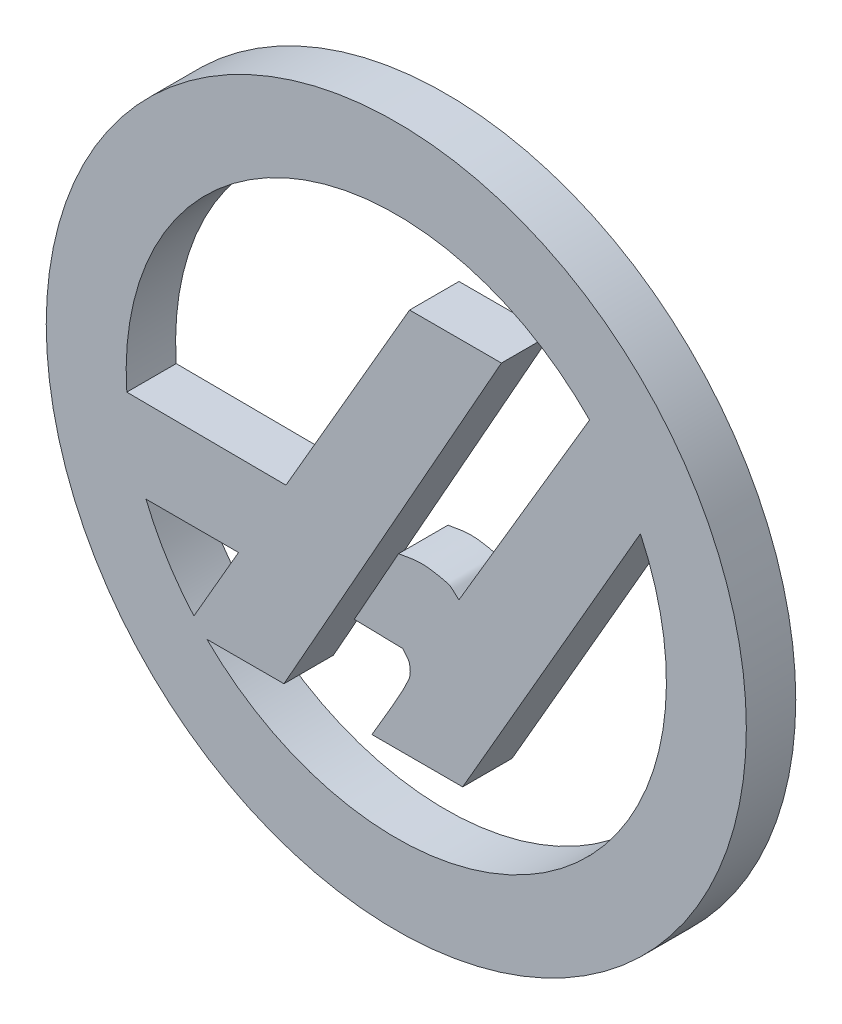
ISO-10303-21;
HEADER;
FILE_DESCRIPTION(('STEP AP214'),'2;1');
FILE_NAME('part.step','',(''),(''),'','','');
FILE_SCHEMA(('AUTOMOTIVE_DESIGN { 1 0 10303 214 1 1 1 1 }'));
ENDSEC;
DATA;
#1=APPLICATION_CONTEXT('core data for automotive mechanical design processes');
#2=APPLICATION_PROTOCOL_DEFINITION('international standard','automotive_design',2000,#1);
#3=PRODUCT_CONTEXT('',#1,'mechanical');
#4=PRODUCT('Part','Part','',(#3));
#5=PRODUCT_RELATED_PRODUCT_CATEGORY('part','',(#4));
#6=PRODUCT_DEFINITION_FORMATION('','',#4);
#7=PRODUCT_DEFINITION_CONTEXT('part definition',#1,'design');
#8=PRODUCT_DEFINITION('design','',#6,#7);
#9=PRODUCT_DEFINITION_SHAPE('','',#8);
#10=(LENGTH_UNIT() NAMED_UNIT(*) SI_UNIT(.MILLI.,.METRE.));
#11=(NAMED_UNIT(*) PLANE_ANGLE_UNIT() SI_UNIT($,.RADIAN.));
#12=(NAMED_UNIT(*) SI_UNIT($,.STERADIAN.) SOLID_ANGLE_UNIT());
#13=UNCERTAINTY_MEASURE_WITH_UNIT(LENGTH_MEASURE(1.E-05),#10,'distance_accuracy_value','');
#14=(GEOMETRIC_REPRESENTATION_CONTEXT(3) GLOBAL_UNCERTAINTY_ASSIGNED_CONTEXT((#13)) GLOBAL_UNIT_ASSIGNED_CONTEXT((#10,
#11,#12)) REPRESENTATION_CONTEXT('',''));
#15=CARTESIAN_POINT('',(0.,0.,0.));
#16=DIRECTION('',(0.,0.,1.));
#17=DIRECTION('',(1.,0.,0.));
#18=AXIS2_PLACEMENT_3D('',#15,#16,#17);
#19=CARTESIAN_POINT('',(456.634031843673,370.7972397232,50.));
#20=DIRECTION('',(0.,0.,1.));
#21=DIRECTION('',(1.,0.,0.));
#22=AXIS2_PLACEMENT_3D('',#19,#20,#21);
#23=PLANE('',#22);
#24=CARTESIAN_POINT('',(456.634031843673,370.7972397232,50.));
#25=DIRECTION('',(0.,0.,1.));
#26=DIRECTION('',(1.,0.,0.));
#27=AXIS2_PLACEMENT_3D('',#24,#25,#26);
#28=CIRCLE('',#27,354.154198637516);
#29=CARTESIAN_POINT('',(810.78823048119,370.7972397232,50.));
#30=VERTEX_POINT('',#29);
#31=EDGE_CURVE('E11',#30,#30,#28,.T.);
#32=ORIENTED_EDGE('',*,*,#31,.T.);
#33=EDGE_LOOP('',(#32));
#34=FACE_BOUND('',#33,.T.);
#35=DIRECTION('',(0.999980711178834,-0.00621106031788096,0.));
#36=VECTOR('',#35,1.);
#37=CARTESIAN_POINT('',(344.999999995328,351.000000011869,50.));
#38=LINE('',#37,#36);
#39=CARTESIAN_POINT('',(183.999999995328,352.000000011869,50.));
#40=VERTEX_POINT('',#39);
#41=CARTESIAN_POINT('',(344.999999995328,351.000000011869,50.));
#42=VERTEX_POINT('',#41);
#43=EDGE_CURVE('E185',#40,#42,#38,.T.);
#44=ORIENTED_EDGE('',*,*,#43,.F.);
#45=CARTESIAN_POINT('',(456.634031843673,370.7972397232,50.));
#46=DIRECTION('',(0.,0.,1.));
#47=DIRECTION('',(1.,0.,0.));
#48=AXIS2_PLACEMENT_3D('',#45,#46,#47);
#49=CIRCLE('',#48,273.281268188381);
#50=CARTESIAN_POINT('',(652.184505988232,561.696856287739,50.));
#51=VERTEX_POINT('',#50);
#52=EDGE_CURVE('E183',#51,#40,#49,.T.);
#53=ORIENTED_EDGE('',*,*,#52,.F.);
#54=DIRECTION('',(0.508729312126642,0.860926528214315,0.));
#55=VECTOR('',#54,1.);
#56=CARTESIAN_POINT('',(652.184505988232,561.696856287739,50.));
#57=LINE('',#56,#55);
#58=CARTESIAN_POINT('',(520.000000000014,337.999999999987,50.));
#59=VERTEX_POINT('',#58);
#60=EDGE_CURVE('E297',#59,#51,#57,.T.);
#61=ORIENTED_EDGE('',*,*,#60,.F.);
#62=CARTESIAN_POINT('',(459.000000000014,347.999999999985,50.));
#63=CARTESIAN_POINT('',(477.851743634498,351.141957272399,50.));
#64=CARTESIAN_POINT('',(483.294181496903,353.05040453136,50.));
#65=CARTESIAN_POINT('',(508.000000000014,346.999999999986,50.));
#66=CARTESIAN_POINT('',(512.856486558174,345.81065635309,50.));
#67=CARTESIAN_POINT('',(516.000000000014,340.999999999987,50.));
#68=CARTESIAN_POINT('',(520.000000000014,337.999999999987,50.));
#69=B_SPLINE_CURVE_WITH_KNOTS('',3,(#62,#63,#64,#65,#66,#67,#68),.UNSPECIFIED.,.F.,.F.,(4,3,4),
(0.,1.,2.),.UNSPECIFIED.);
#70=CARTESIAN_POINT('',(459.000000000014,347.999999999985,50.));
#71=VERTEX_POINT('',#70);
#72=EDGE_CURVE('E291',#71,#59,#69,.T.);
#73=ORIENTED_EDGE('',*,*,#72,.F.);
#74=DIRECTION('',(0.488992524128992,0.872287975009376,0.));
#75=VECTOR('',#74,1.);
#76=CARTESIAN_POINT('',(459.000000000014,347.999999999985,50.));
#77=LINE('',#76,#75);
#78=CARTESIAN_POINT('',(414.153111070255,268.000000000617,50.));
#79=VERTEX_POINT('',#78);
#80=EDGE_CURVE('E298',#79,#71,#77,.T.);
#81=ORIENTED_EDGE('',*,*,#80,.F.);
#82=DIRECTION('',(-0.999790511734195,0.020467844201998,0.));
#83=VECTOR('',#82,1.);
#84=CARTESIAN_POINT('',(414.153111070255,268.000000000617,50.));
#85=LINE('',#84,#83);
#86=CARTESIAN_POINT('',(463.000000000014,266.999999999985,50.));
#87=VERTEX_POINT('',#86);
#88=EDGE_CURVE('E207',#87,#79,#85,.T.);
#89=ORIENTED_EDGE('',*,*,#88,.F.);
#90=CARTESIAN_POINT('',(432.000000000013,175.999999999985,50.));
#91=CARTESIAN_POINT('',(444.333333333347,197.999999999985,50.));
#92=CARTESIAN_POINT('',(458.288028235039,219.166586500959,50.));
#93=CARTESIAN_POINT('',(469.000000000014,241.999999999985,50.));
#94=CARTESIAN_POINT('',(471.128314938588,246.536671316419,50.));
#95=CARTESIAN_POINT('',(471.169454920433,252.127271164905,50.));
#96=CARTESIAN_POINT('',(470.000000000014,256.999999999985,50.));
#97=CARTESIAN_POINT('',(469.050440025481,260.956499893871,50.));
#98=CARTESIAN_POINT('',(465.333333333347,263.666666666652,50.));
#99=CARTESIAN_POINT('',(463.000000000014,266.999999999985,50.));
#100=B_SPLINE_CURVE_WITH_KNOTS('',3,(#90,#91,#92,#93,#94,#95,#96,#97,#98,#99),.UNSPECIFIED.,.F.,
.F.,(4,3,3,4),(0.,1.,2.,3.),.UNSPECIFIED.);
#101=CARTESIAN_POINT('',(432.000000000013,175.999999999985,50.));
#102=VERTEX_POINT('',#101);
#103=EDGE_CURVE('E202',#102,#87,#100,.T.);
#104=ORIENTED_EDGE('',*,*,#103,.F.);
#105=DIRECTION('',(-1.,0.,0.));
#106=VECTOR('',#105,1.);
#107=CARTESIAN_POINT('',(432.000000000013,175.999999999985,50.));
#108=LINE('',#107,#106);
#109=CARTESIAN_POINT('',(523.78372406925,175.999999999985,50.));
#110=VERTEX_POINT('',#109);
#111=EDGE_CURVE('E200',#110,#102,#108,.T.);
#112=ORIENTED_EDGE('',*,*,#111,.F.);
#113=DIRECTION('',(-0.499610631852908,-0.866250088911705,0.));
#114=VECTOR('',#113,1.);
#115=CARTESIAN_POINT('',(523.78372406925,175.999999999985,50.));
#116=LINE('',#115,#114);
#117=CARTESIAN_POINT('',(703.607534397801,487.78758367857,50.));
#118=VERTEX_POINT('',#117);
#119=EDGE_CURVE('E198',#118,#110,#116,.T.);
#120=ORIENTED_EDGE('',*,*,#119,.F.);
#121=CARTESIAN_POINT('',(456.634031843673,370.7972397232,50.));
#122=DIRECTION('',(0.,0.,1.));
#123=DIRECTION('',(1.,0.,0.));
#124=AXIS2_PLACEMENT_3D('',#121,#122,#123);
#125=CIRCLE('',#124,273.281268188381);
#126=CARTESIAN_POINT('',(264.996930573145,175.969436370395,50.));
#127=VERTEX_POINT('',#126);
#128=EDGE_CURVE('E196',#127,#118,#125,.T.);
#129=ORIENTED_EDGE('',*,*,#128,.F.);
#130=DIRECTION('',(-0.999999923235036,-0.000391828944071524,0.));
#131=VECTOR('',#130,1.);
#132=CARTESIAN_POINT('',(264.996930573145,175.969436370395,50.));
#133=LINE('',#132,#131);
#134=CARTESIAN_POINT('',(342.999405137408,175.999999999985,50.));
#135=VERTEX_POINT('',#134);
#136=EDGE_CURVE('E194',#135,#127,#133,.T.);
#137=ORIENTED_EDGE('',*,*,#136,.F.);
#138=DIRECTION('',(-0.490368068183299,-0.871515437445706,0.));
#139=VECTOR('',#138,1.);
#140=CARTESIAN_POINT('',(342.999405137408,175.999999999985,50.));
#141=LINE('',#140,#139);
#142=CARTESIAN_POINT('',(562.999999995105,567.000000012326,50.));
#143=VERTEX_POINT('',#142);
#144=EDGE_CURVE('E192',#143,#135,#141,.T.);
#145=ORIENTED_EDGE('',*,*,#144,.F.);
#146=DIRECTION('',(1.,0.,0.));
#147=VECTOR('',#146,1.);
#148=CARTESIAN_POINT('',(562.999999995105,567.000000012326,50.));
#149=LINE('',#148,#147);
#150=CARTESIAN_POINT('',(470.080751257169,567.000000012326,50.));
#151=VERTEX_POINT('',#150);
#152=EDGE_CURVE('E190',#151,#143,#149,.T.);
#153=ORIENTED_EDGE('',*,*,#152,.F.);
#154=DIRECTION('',(0.501120644832425,0.865377431715627,0.));
#155=VECTOR('',#154,1.);
#156=CARTESIAN_POINT('',(470.080751257169,567.000000012326,50.));
#157=LINE('',#156,#155);
#158=EDGE_CURVE('E188',#42,#151,#157,.T.);
#159=ORIENTED_EDGE('',*,*,#158,.F.);
#160=EDGE_LOOP('',(#44,#53,#61,#73,#81,#89,#104,#112,#120,#129,#137,#145,#153,#159));
#161=FACE_BOUND('',#160,.T.);
#162=DIRECTION('',(0.499722453489577,0.866185586048601,0.));
#163=VECTOR('',#162,1.);
#164=CARTESIAN_POINT('',(297.000000000021,268.000000000617,50.));
#165=LINE('',#164,#163);
#166=CARTESIAN_POINT('',(251.884299831457,189.799453041773,50.));
#167=VERTEX_POINT('',#166);
#168=CARTESIAN_POINT('',(297.000000000021,268.000000000617,50.));
#169=VERTEX_POINT('',#168);
#170=EDGE_CURVE('E164',#167,#169,#165,.T.);
#171=ORIENTED_EDGE('',*,*,#170,.F.);
#172=CARTESIAN_POINT('',(456.634031843673,370.7972397232,50.));
#173=DIRECTION('',(0.,0.,1.));
#174=DIRECTION('',(1.,0.,0.));
#175=AXIS2_PLACEMENT_3D('',#172,#173,#174);
#176=CIRCLE('',#175,273.281268188381);
#177=CARTESIAN_POINT('',(203.423883847848,268.000000000617,50.));
#178=VERTEX_POINT('',#177);
#179=EDGE_CURVE('E156',#178,#167,#176,.T.);
#180=ORIENTED_EDGE('',*,*,#179,.F.);
#181=DIRECTION('',(-1.,0.,0.));
#182=VECTOR('',#181,1.);
#183=CARTESIAN_POINT('',(203.423883847848,268.000000000617,50.));
#184=LINE('',#183,#182);
#185=EDGE_CURVE('E173',#169,#178,#184,.T.);
#186=ORIENTED_EDGE('',*,*,#185,.F.);
#187=EDGE_LOOP('',(#171,#180,#186));
#188=FACE_BOUND('',#187,.T.);
#189=ADVANCED_FACE('F37',(#34,#161,#188),#23,.T.);
#190=CARTESIAN_POINT('',(456.634031843673,370.7972397232,0.));
#191=DIRECTION('',(0.,0.,1.));
#192=DIRECTION('',(1.,0.,0.));
#193=AXIS2_PLACEMENT_3D('',#190,#191,#192);
#194=PLANE('',#193);
#195=CARTESIAN_POINT('',(456.634031843673,370.7972397232,0.));
#196=DIRECTION('',(0.,0.,1.));
#197=DIRECTION('',(1.,0.,0.));
#198=AXIS2_PLACEMENT_3D('',#195,#196,#197);
#199=CIRCLE('',#198,273.281268188381);
#200=CARTESIAN_POINT('',(652.184505988232,561.696856287739,0.));
#201=VERTEX_POINT('',#200);
#202=CARTESIAN_POINT('',(183.999999995328,352.000000011869,0.));
#203=VERTEX_POINT('',#202);
#204=EDGE_CURVE('E171',#201,#203,#199,.T.);
#205=ORIENTED_EDGE('',*,*,#204,.T.);
#206=DIRECTION('',(0.999980711178834,-0.00621106031788096,0.));
#207=VECTOR('',#206,1.);
#208=CARTESIAN_POINT('',(344.999999995328,351.000000011869,0.));
#209=LINE('',#208,#207);
#210=CARTESIAN_POINT('',(344.999999995328,351.000000011869,0.));
#211=VERTEX_POINT('',#210);
#212=EDGE_CURVE('E305',#203,#211,#209,.T.);
#213=ORIENTED_EDGE('',*,*,#212,.T.);
#214=DIRECTION('',(0.501120644832425,0.865377431715627,0.));
#215=VECTOR('',#214,1.);
#216=CARTESIAN_POINT('',(470.080751257169,567.000000012326,0.));
#217=LINE('',#216,#215);
#218=CARTESIAN_POINT('',(470.080751257169,567.000000012326,0.));
#219=VERTEX_POINT('',#218);
#220=EDGE_CURVE('E307',#211,#219,#217,.T.);
#221=ORIENTED_EDGE('',*,*,#220,.T.);
#222=DIRECTION('',(1.,0.,0.));
#223=VECTOR('',#222,1.);
#224=CARTESIAN_POINT('',(562.999999995105,567.000000012326,0.));
#225=LINE('',#224,#223);
#226=CARTESIAN_POINT('',(562.999999995105,567.000000012326,0.));
#227=VERTEX_POINT('',#226);
#228=EDGE_CURVE('E310',#219,#227,#225,.T.);
#229=ORIENTED_EDGE('',*,*,#228,.T.);
#230=DIRECTION('',(-0.490368068183299,-0.871515437445706,0.));
#231=VECTOR('',#230,1.);
#232=CARTESIAN_POINT('',(342.999405137408,175.999999999985,0.));
#233=LINE('',#232,#231);
#234=CARTESIAN_POINT('',(342.999405137408,175.999999999985,0.));
#235=VERTEX_POINT('',#234);
#236=EDGE_CURVE('E313',#227,#235,#233,.T.);
#237=ORIENTED_EDGE('',*,*,#236,.T.);
#238=DIRECTION('',(-0.999999923235036,-0.000391828944071524,0.));
#239=VECTOR('',#238,1.);
#240=CARTESIAN_POINT('',(264.996930573145,175.969436370395,0.));
#241=LINE('',#240,#239);
#242=CARTESIAN_POINT('',(264.996930573145,175.969436370395,0.));
#243=VERTEX_POINT('',#242);
#244=EDGE_CURVE('E316',#235,#243,#241,.T.);
#245=ORIENTED_EDGE('',*,*,#244,.T.);
#246=CARTESIAN_POINT('',(456.634031843673,370.7972397232,0.));
#247=DIRECTION('',(0.,0.,1.));
#248=DIRECTION('',(1.,0.,0.));
#249=AXIS2_PLACEMENT_3D('',#246,#247,#248);
#250=CIRCLE('',#249,273.281268188381);
#251=CARTESIAN_POINT('',(703.607534397801,487.78758367857,0.));
#252=VERTEX_POINT('',#251);
#253=EDGE_CURVE('E319',#243,#252,#250,.T.);
#254=ORIENTED_EDGE('',*,*,#253,.T.);
#255=DIRECTION('',(-0.499610631852908,-0.866250088911705,0.));
#256=VECTOR('',#255,1.);
#257=CARTESIAN_POINT('',(523.78372406925,175.999999999985,0.));
#258=LINE('',#257,#256);
#259=CARTESIAN_POINT('',(523.78372406925,175.999999999985,0.));
#260=VERTEX_POINT('',#259);
#261=EDGE_CURVE('E322',#252,#260,#258,.T.);
#262=ORIENTED_EDGE('',*,*,#261,.T.);
#263=DIRECTION('',(-1.,0.,0.));
#264=VECTOR('',#263,1.);
#265=CARTESIAN_POINT('',(432.000000000013,175.999999999985,0.));
#266=LINE('',#265,#264);
#267=CARTESIAN_POINT('',(432.000000000013,175.999999999985,0.));
#268=VERTEX_POINT('',#267);
#269=EDGE_CURVE('E325',#260,#268,#266,.T.);
#270=ORIENTED_EDGE('',*,*,#269,.T.);
#271=CARTESIAN_POINT('',(432.000000000013,175.999999999985,0.));
#272=CARTESIAN_POINT('',(444.333333333347,197.999999999985,0.));
#273=CARTESIAN_POINT('',(458.288028235039,219.166586500959,0.));
#274=CARTESIAN_POINT('',(469.000000000014,241.999999999985,0.));
#275=CARTESIAN_POINT('',(471.128314938588,246.536671316419,0.));
#276=CARTESIAN_POINT('',(471.169454920433,252.127271164905,0.));
#277=CARTESIAN_POINT('',(470.000000000014,256.999999999985,0.));
#278=CARTESIAN_POINT('',(469.050440025481,260.956499893871,0.));
#279=CARTESIAN_POINT('',(465.333333333347,263.666666666652,0.));
#280=CARTESIAN_POINT('',(463.000000000014,266.999999999985,0.));
#281=B_SPLINE_CURVE_WITH_KNOTS('',3,(#271,#272,#273,#274,#275,#276,#277,#278,#279,#280),
.UNSPECIFIED.,.F.,.F.,(4,3,3,4),(0.,1.,2.,3.),.UNSPECIFIED.);
#282=CARTESIAN_POINT('',(463.000000000014,266.999999999985,0.));
#283=VERTEX_POINT('',#282);
#284=EDGE_CURVE('E328',#268,#283,#281,.T.);
#285=ORIENTED_EDGE('',*,*,#284,.T.);
#286=DIRECTION('',(-0.999790511734195,0.020467844201998,0.));
#287=VECTOR('',#286,1.);
#288=CARTESIAN_POINT('',(414.153111070255,268.000000000617,0.));
#289=LINE('',#288,#287);
#290=CARTESIAN_POINT('',(414.153111070255,268.000000000617,0.));
#291=VERTEX_POINT('',#290);
#292=EDGE_CURVE('E333',#283,#291,#289,.T.);
#293=ORIENTED_EDGE('',*,*,#292,.T.);
#294=DIRECTION('',(0.488992524128992,0.872287975009376,0.));
#295=VECTOR('',#294,1.);
#296=CARTESIAN_POINT('',(459.000000000014,347.999999999985,0.));
#297=LINE('',#296,#295);
#298=CARTESIAN_POINT('',(459.000000000014,347.999999999985,0.));
#299=VERTEX_POINT('',#298);
#300=EDGE_CURVE('E339',#291,#299,#297,.T.);
#301=ORIENTED_EDGE('',*,*,#300,.T.);
#302=CARTESIAN_POINT('',(459.000000000014,347.999999999985,0.));
#303=CARTESIAN_POINT('',(477.851743634498,351.141957272399,0.));
#304=CARTESIAN_POINT('',(483.294181496903,353.05040453136,0.));
#305=CARTESIAN_POINT('',(508.000000000014,346.999999999986,0.));
#306=CARTESIAN_POINT('',(512.856486558174,345.81065635309,0.));
#307=CARTESIAN_POINT('',(516.000000000014,340.999999999987,0.));
#308=CARTESIAN_POINT('',(520.000000000014,337.999999999987,0.));
#309=B_SPLINE_CURVE_WITH_KNOTS('',3,(#302,#303,#304,#305,#306,#307,#308),.UNSPECIFIED.,.F.,.F.,
(4,3,4),(0.,1.,2.),.UNSPECIFIED.);
#310=CARTESIAN_POINT('',(520.000000000014,337.999999999987,0.));
#311=VERTEX_POINT('',#310);
#312=EDGE_CURVE('E342',#299,#311,#309,.T.);
#313=ORIENTED_EDGE('',*,*,#312,.T.);
#314=DIRECTION('',(0.508729312126642,0.860926528214315,0.));
#315=VECTOR('',#314,1.);
#316=CARTESIAN_POINT('',(652.184505988232,561.696856287739,0.));
#317=LINE('',#316,#315);
#318=EDGE_CURVE('E186',#311,#201,#317,.T.);
#319=ORIENTED_EDGE('',*,*,#318,.T.);
#320=EDGE_LOOP('',(#205,#213,#221,#229,#237,#245,#254,#262,#270,#285,#293,#301,#313,#319));
#321=FACE_BOUND('',#320,.T.);
#322=CARTESIAN_POINT('',(456.634031843673,370.7972397232,0.));
#323=DIRECTION('',(0.,0.,1.));
#324=DIRECTION('',(1.,0.,0.));
#325=AXIS2_PLACEMENT_3D('',#322,#323,#324);
#326=CIRCLE('',#325,354.154198637516);
#327=CARTESIAN_POINT('',(810.78823048119,370.7972397232,0.));
#328=VERTEX_POINT('',#327);
#329=EDGE_CURVE('E41',#328,#328,#326,.T.);
#330=ORIENTED_EDGE('',*,*,#329,.F.);
#331=EDGE_LOOP('',(#330));
#332=FACE_BOUND('',#331,.T.);
#333=CARTESIAN_POINT('',(456.634031843673,370.7972397232,0.));
#334=DIRECTION('',(0.,0.,1.));
#335=DIRECTION('',(1.,0.,0.));
#336=AXIS2_PLACEMENT_3D('',#333,#334,#335);
#337=CIRCLE('',#336,273.281268188381);
#338=CARTESIAN_POINT('',(203.423883847848,268.000000000617,0.));
#339=VERTEX_POINT('',#338);
#340=CARTESIAN_POINT('',(251.884299831457,189.799453041773,0.));
#341=VERTEX_POINT('',#340);
#342=EDGE_CURVE('E60',#339,#341,#337,.T.);
#343=ORIENTED_EDGE('',*,*,#342,.T.);
#344=DIRECTION('',(0.499722453489577,0.866185586048601,0.));
#345=VECTOR('',#344,1.);
#346=CARTESIAN_POINT('',(297.000000000021,268.000000000617,0.));
#347=LINE('',#346,#345);
#348=CARTESIAN_POINT('',(297.000000000021,268.000000000617,0.));
#349=VERTEX_POINT('',#348);
#350=EDGE_CURVE('E170',#341,#349,#347,.T.);
#351=ORIENTED_EDGE('',*,*,#350,.T.);
#352=DIRECTION('',(-1.,0.,0.));
#353=VECTOR('',#352,1.);
#354=CARTESIAN_POINT('',(203.423883847848,268.000000000617,0.));
#355=LINE('',#354,#353);
#356=EDGE_CURVE('E165',#349,#339,#355,.T.);
#357=ORIENTED_EDGE('',*,*,#356,.T.);
#358=EDGE_LOOP('',(#343,#351,#357));
#359=FACE_BOUND('',#358,.T.);
#360=ADVANCED_FACE('F257',(#321,#332,#359),#194,.F.);
#361=CARTESIAN_POINT('',(456.634031843673,370.7972397232,50.));
#362=DIRECTION('',(0.,0.,-1.));
#363=DIRECTION('',(-1.,0.,0.));
#364=AXIS2_PLACEMENT_3D('',#361,#362,#363);
#365=CYLINDRICAL_SURFACE('',#364,354.154198637516);
#366=ORIENTED_EDGE('',*,*,#31,.F.);
#367=EDGE_LOOP('',(#366));
#368=FACE_BOUND('',#367,.T.);
#369=ORIENTED_EDGE('',*,*,#329,.T.);
#370=EDGE_LOOP('',(#369));
#371=FACE_BOUND('',#370,.T.);
#372=ADVANCED_FACE('F39',(#368,#371),#365,.T.);
#373=CARTESIAN_POINT('',(456.634031843673,370.7972397232,50.));
#374=DIRECTION('',(0.,0.,-1.));
#375=DIRECTION('',(-1.,0.,0.));
#376=AXIS2_PLACEMENT_3D('',#373,#374,#375);
#377=CYLINDRICAL_SURFACE('',#376,273.281268188381);
#378=ORIENTED_EDGE('',*,*,#204,.F.);
#379=DIRECTION('',(0.,0.,-1.));
#380=VECTOR('',#379,1.);
#381=CARTESIAN_POINT('',(652.184505988232,561.696856287739,50.));
#382=LINE('',#381,#380);
#383=EDGE_CURVE('E303',#51,#201,#382,.T.);
#384=ORIENTED_EDGE('',*,*,#383,.F.);
#385=ORIENTED_EDGE('',*,*,#52,.T.);
#386=DIRECTION('',(0.,0.,-1.));
#387=VECTOR('',#386,1.);
#388=CARTESIAN_POINT('',(183.999999995328,352.000000011869,50.));
#389=LINE('',#388,#387);
#390=EDGE_CURVE('E377',#40,#203,#389,.T.);
#391=ORIENTED_EDGE('',*,*,#390,.T.);
#392=EDGE_LOOP('',(#378,#384,#385,#391));
#393=FACE_BOUND('',#392,.T.);
#394=ADVANCED_FACE('F251',(#393),#377,.F.);
#395=CARTESIAN_POINT('',(344.999999995328,351.000000011869,50.));
#396=DIRECTION('',(0.00621106031788096,0.999980711178834,0.));
#397=DIRECTION('',(-0.999980711178835,0.00621106031788096,0.));
#398=AXIS2_PLACEMENT_3D('',#395,#396,#397);
#399=PLANE('',#398);
#400=ORIENTED_EDGE('',*,*,#212,.F.);
#401=ORIENTED_EDGE('',*,*,#390,.F.);
#402=ORIENTED_EDGE('',*,*,#43,.T.);
#403=DIRECTION('',(0.,0.,-1.));
#404=VECTOR('',#403,1.);
#405=CARTESIAN_POINT('',(344.999999995328,351.000000011869,50.));
#406=LINE('',#405,#404);
#407=EDGE_CURVE('E375',#42,#211,#406,.T.);
#408=ORIENTED_EDGE('',*,*,#407,.T.);
#409=EDGE_LOOP('',(#400,#401,#402,#408));
#410=FACE_BOUND('',#409,.T.);
#411=ADVANCED_FACE('F247',(#410),#399,.T.);
#412=CARTESIAN_POINT('',(470.080751257169,567.000000012326,50.));
#413=DIRECTION('',(-0.865377431715627,0.501120644832425,0.));
#414=DIRECTION('',(-0.501120644832425,-0.865377431715627,0.));
#415=AXIS2_PLACEMENT_3D('',#412,#413,#414);
#416=PLANE('',#415);
#417=ORIENTED_EDGE('',*,*,#220,.F.);
#418=ORIENTED_EDGE('',*,*,#407,.F.);
#419=ORIENTED_EDGE('',*,*,#158,.T.);
#420=DIRECTION('',(0.,0.,-1.));
#421=VECTOR('',#420,1.);
#422=CARTESIAN_POINT('',(470.080751257169,567.000000012326,50.));
#423=LINE('',#422,#421);
#424=EDGE_CURVE('E373',#151,#219,#423,.T.);
#425=ORIENTED_EDGE('',*,*,#424,.T.);
#426=EDGE_LOOP('',(#417,#418,#419,#425));
#427=FACE_BOUND('',#426,.T.);
#428=ADVANCED_FACE('F243',(#427),#416,.T.);
#429=CARTESIAN_POINT('',(562.999999995105,567.000000012326,50.));
#430=DIRECTION('',(0.,1.,0.));
#431=DIRECTION('',(-1.,0.,0.));
#432=AXIS2_PLACEMENT_3D('',#429,#430,#431);
#433=PLANE('',#432);
#434=ORIENTED_EDGE('',*,*,#228,.F.);
#435=ORIENTED_EDGE('',*,*,#424,.F.);
#436=ORIENTED_EDGE('',*,*,#152,.T.);
#437=DIRECTION('',(0.,0.,-1.));
#438=VECTOR('',#437,1.);
#439=CARTESIAN_POINT('',(562.999999995105,567.000000012326,50.));
#440=LINE('',#439,#438);
#441=EDGE_CURVE('E371',#143,#227,#440,.T.);
#442=ORIENTED_EDGE('',*,*,#441,.T.);
#443=EDGE_LOOP('',(#434,#435,#436,#442));
#444=FACE_BOUND('',#443,.T.);
#445=ADVANCED_FACE('F239',(#444),#433,.T.);
#446=CARTESIAN_POINT('',(342.999405137408,175.999999999985,50.));
#447=DIRECTION('',(0.871515437445706,-0.490368068183298,0.));
#448=DIRECTION('',(0.490368068183299,0.871515437445706,0.));
#449=AXIS2_PLACEMENT_3D('',#446,#447,#448);
#450=PLANE('',#449);
#451=ORIENTED_EDGE('',*,*,#236,.F.);
#452=ORIENTED_EDGE('',*,*,#441,.F.);
#453=ORIENTED_EDGE('',*,*,#144,.T.);
#454=DIRECTION('',(0.,0.,-1.));
#455=VECTOR('',#454,1.);
#456=CARTESIAN_POINT('',(342.999405137408,175.999999999985,50.));
#457=LINE('',#456,#455);
#458=EDGE_CURVE('E369',#135,#235,#457,.T.);
#459=ORIENTED_EDGE('',*,*,#458,.T.);
#460=EDGE_LOOP('',(#451,#452,#453,#459));
#461=FACE_BOUND('',#460,.T.);
#462=ADVANCED_FACE('F235',(#461),#450,.T.);
#463=CARTESIAN_POINT('',(264.996930573145,175.969436370395,50.));
#464=DIRECTION('',(0.000391828944071524,-0.999999923235036,0.));
#465=DIRECTION('',(0.999999923235037,0.000391828944071524,0.));
#466=AXIS2_PLACEMENT_3D('',#463,#464,#465);
#467=PLANE('',#466);
#468=ORIENTED_EDGE('',*,*,#244,.F.);
#469=ORIENTED_EDGE('',*,*,#458,.F.);
#470=ORIENTED_EDGE('',*,*,#136,.T.);
#471=DIRECTION('',(0.,0.,-1.));
#472=VECTOR('',#471,1.);
#473=CARTESIAN_POINT('',(264.996930573145,175.969436370395,50.));
#474=LINE('',#473,#472);
#475=EDGE_CURVE('E367',#127,#243,#474,.T.);
#476=ORIENTED_EDGE('',*,*,#475,.T.);
#477=EDGE_LOOP('',(#468,#469,#470,#476));
#478=FACE_BOUND('',#477,.T.);
#479=ADVANCED_FACE('F231',(#478),#467,.T.);
#480=CARTESIAN_POINT('',(456.634031843673,370.7972397232,50.));
#481=DIRECTION('',(0.,0.,-1.));
#482=DIRECTION('',(-1.,0.,0.));
#483=AXIS2_PLACEMENT_3D('',#480,#481,#482);
#484=CYLINDRICAL_SURFACE('',#483,273.281268188381);
#485=ORIENTED_EDGE('',*,*,#253,.F.);
#486=ORIENTED_EDGE('',*,*,#475,.F.);
#487=ORIENTED_EDGE('',*,*,#128,.T.);
#488=DIRECTION('',(0.,0.,-1.));
#489=VECTOR('',#488,1.);
#490=CARTESIAN_POINT('',(703.607534397801,487.78758367857,50.));
#491=LINE('',#490,#489);
#492=EDGE_CURVE('E365',#118,#252,#491,.T.);
#493=ORIENTED_EDGE('',*,*,#492,.T.);
#494=EDGE_LOOP('',(#485,#486,#487,#493));
#495=FACE_BOUND('',#494,.T.);
#496=ADVANCED_FACE('F227',(#495),#484,.F.);
#497=CARTESIAN_POINT('',(523.78372406925,175.999999999985,50.));
#498=DIRECTION('',(0.866250088911705,-0.499610631852908,0.));
#499=DIRECTION('',(0.499610631852909,0.866250088911706,0.));
#500=AXIS2_PLACEMENT_3D('',#497,#498,#499);
#501=PLANE('',#500);
#502=ORIENTED_EDGE('',*,*,#261,.F.);
#503=ORIENTED_EDGE('',*,*,#492,.F.);
#504=ORIENTED_EDGE('',*,*,#119,.T.);
#505=DIRECTION('',(0.,0.,-1.));
#506=VECTOR('',#505,1.);
#507=CARTESIAN_POINT('',(523.78372406925,175.999999999985,50.));
#508=LINE('',#507,#506);
#509=EDGE_CURVE('E363',#110,#260,#508,.T.);
#510=ORIENTED_EDGE('',*,*,#509,.T.);
#511=EDGE_LOOP('',(#502,#503,#504,#510));
#512=FACE_BOUND('',#511,.T.);
#513=ADVANCED_FACE('F223',(#512),#501,.T.);
#514=CARTESIAN_POINT('',(432.000000000013,175.999999999985,50.));
#515=DIRECTION('',(0.,-1.,0.));
#516=DIRECTION('',(0.,0.,-1.));
#517=AXIS2_PLACEMENT_3D('',#514,#515,#516);
#518=PLANE('',#517);
#519=ORIENTED_EDGE('',*,*,#269,.F.);
#520=ORIENTED_EDGE('',*,*,#509,.F.);
#521=ORIENTED_EDGE('',*,*,#111,.T.);
#522=DIRECTION('',(0.,0.,-1.));
#523=VECTOR('',#522,1.);
#524=CARTESIAN_POINT('',(432.000000000013,175.999999999985,50.));
#525=LINE('',#524,#523);
#526=EDGE_CURVE('E361',#102,#268,#525,.T.);
#527=ORIENTED_EDGE('',*,*,#526,.T.);
#528=EDGE_LOOP('',(#519,#520,#521,#527));
#529=FACE_BOUND('',#528,.T.);
#530=ADVANCED_FACE('F218',(#529),#518,.T.);
#531=DIRECTION('',(0.,0.,-1.));
#532=VECTOR('',#531,1.);
#533=SURFACE_OF_LINEAR_EXTRUSION('',#100,#532);
#534=ORIENTED_EDGE('',*,*,#284,.F.);
#535=ORIENTED_EDGE('',*,*,#526,.F.);
#536=ORIENTED_EDGE('',*,*,#103,.T.);
#537=DIRECTION('',(0.,0.,-1.));
#538=VECTOR('',#537,1.);
#539=CARTESIAN_POINT('',(463.000000000014,266.999999999985,50.));
#540=LINE('',#539,#538);
#541=EDGE_CURVE('E359',#87,#283,#540,.T.);
#542=ORIENTED_EDGE('',*,*,#541,.T.);
#543=EDGE_LOOP('',(#534,#535,#536,#542));
#544=FACE_BOUND('',#543,.T.);
#545=ADVANCED_FACE('F213',(#544),#533,.T.);
#546=CARTESIAN_POINT('',(414.153111070255,268.000000000617,50.));
#547=DIRECTION('',(-0.020467844201998,-0.999790511734195,0.));
#548=DIRECTION('',(0.999790511734195,-0.020467844201998,0.));
#549=AXIS2_PLACEMENT_3D('',#546,#547,#548);
#550=PLANE('',#549);
#551=ORIENTED_EDGE('',*,*,#292,.F.);
#552=ORIENTED_EDGE('',*,*,#541,.F.);
#553=ORIENTED_EDGE('',*,*,#88,.T.);
#554=DIRECTION('',(0.,0.,-1.));
#555=VECTOR('',#554,1.);
#556=CARTESIAN_POINT('',(414.153111070255,268.000000000617,50.));
#557=LINE('',#556,#555);
#558=EDGE_CURVE('E357',#79,#291,#557,.T.);
#559=ORIENTED_EDGE('',*,*,#558,.T.);
#560=EDGE_LOOP('',(#551,#552,#553,#559));
#561=FACE_BOUND('',#560,.T.);
#562=ADVANCED_FACE('F217',(#561),#550,.T.);
#563=CARTESIAN_POINT('',(459.000000000014,347.999999999985,50.));
#564=DIRECTION('',(-0.872287975009376,0.488992524128992,0.));
#565=DIRECTION('',(-0.488992524128992,-0.872287975009376,0.));
#566=AXIS2_PLACEMENT_3D('',#563,#564,#565);
#567=PLANE('',#566);
#568=ORIENTED_EDGE('',*,*,#300,.F.);
#569=ORIENTED_EDGE('',*,*,#558,.F.);
#570=ORIENTED_EDGE('',*,*,#80,.T.);
#571=DIRECTION('',(0.,0.,-1.));
#572=VECTOR('',#571,1.);
#573=CARTESIAN_POINT('',(459.000000000014,347.999999999985,50.));
#574=LINE('',#573,#572);
#575=EDGE_CURVE('E355',#71,#299,#574,.T.);
#576=ORIENTED_EDGE('',*,*,#575,.T.);
#577=EDGE_LOOP('',(#568,#569,#570,#576));
#578=FACE_BOUND('',#577,.T.);
#579=ADVANCED_FACE('F289',(#578),#567,.T.);
#580=DIRECTION('',(0.,0.,-1.));
#581=VECTOR('',#580,1.);
#582=SURFACE_OF_LINEAR_EXTRUSION('',#69,#581);
#583=ORIENTED_EDGE('',*,*,#312,.F.);
#584=ORIENTED_EDGE('',*,*,#575,.F.);
#585=ORIENTED_EDGE('',*,*,#72,.T.);
#586=DIRECTION('',(0.,0.,-1.));
#587=VECTOR('',#586,1.);
#588=CARTESIAN_POINT('',(520.000000000014,337.999999999987,50.));
#589=LINE('',#588,#587);
#590=EDGE_CURVE('E353',#59,#311,#589,.T.);
#591=ORIENTED_EDGE('',*,*,#590,.T.);
#592=EDGE_LOOP('',(#583,#584,#585,#591));
#593=FACE_BOUND('',#592,.T.);
#594=ADVANCED_FACE('F285',(#593),#582,.T.);
#595=CARTESIAN_POINT('',(652.184505988232,561.696856287739,50.));
#596=DIRECTION('',(-0.860926528214315,0.508729312126642,0.));
#597=DIRECTION('',(-0.508729312126642,-0.860926528214315,0.));
#598=AXIS2_PLACEMENT_3D('',#595,#596,#597);
#599=PLANE('',#598);
#600=ORIENTED_EDGE('',*,*,#318,.F.);
#601=ORIENTED_EDGE('',*,*,#590,.F.);
#602=ORIENTED_EDGE('',*,*,#60,.T.);
#603=ORIENTED_EDGE('',*,*,#383,.T.);
#604=EDGE_LOOP('',(#600,#601,#602,#603));
#605=FACE_BOUND('',#604,.T.);
#606=ADVANCED_FACE('F282',(#605),#599,.T.);
#607=CARTESIAN_POINT('',(456.634031843673,370.7972397232,50.));
#608=DIRECTION('',(0.,0.,-1.));
#609=DIRECTION('',(-1.,0.,0.));
#610=AXIS2_PLACEMENT_3D('',#607,#608,#609);
#611=CYLINDRICAL_SURFACE('',#610,273.281268188381);
#612=ORIENTED_EDGE('',*,*,#342,.F.);
#613=DIRECTION('',(0.,0.,-1.));
#614=VECTOR('',#613,1.);
#615=CARTESIAN_POINT('',(203.423883847848,268.000000000617,50.));
#616=LINE('',#615,#614);
#617=EDGE_CURVE('E160',#178,#339,#616,.T.);
#618=ORIENTED_EDGE('',*,*,#617,.F.);
#619=ORIENTED_EDGE('',*,*,#179,.T.);
#620=DIRECTION('',(0.,0.,-1.));
#621=VECTOR('',#620,1.);
#622=CARTESIAN_POINT('',(251.884299831457,189.799453041773,50.));
#623=LINE('',#622,#621);
#624=EDGE_CURVE('E159',#167,#341,#623,.T.);
#625=ORIENTED_EDGE('',*,*,#624,.T.);
#626=EDGE_LOOP('',(#612,#618,#619,#625));
#627=FACE_BOUND('',#626,.T.);
#628=ADVANCED_FACE('F158',(#627),#611,.F.);
#629=CARTESIAN_POINT('',(297.000000000021,268.000000000617,50.));
#630=DIRECTION('',(-0.866185586048601,0.499722453489577,0.));
#631=DIRECTION('',(-0.499722453489577,-0.866185586048601,0.));
#632=AXIS2_PLACEMENT_3D('',#629,#630,#631);
#633=PLANE('',#632);
#634=ORIENTED_EDGE('',*,*,#350,.F.);
#635=ORIENTED_EDGE('',*,*,#624,.F.);
#636=ORIENTED_EDGE('',*,*,#170,.T.);
#637=DIRECTION('',(0.,0.,-1.));
#638=VECTOR('',#637,1.);
#639=CARTESIAN_POINT('',(297.000000000021,268.000000000617,50.));
#640=LINE('',#639,#638);
#641=EDGE_CURVE('E52',#169,#349,#640,.T.);
#642=ORIENTED_EDGE('',*,*,#641,.T.);
#643=EDGE_LOOP('',(#634,#635,#636,#642));
#644=FACE_BOUND('',#643,.T.);
#645=ADVANCED_FACE('F168',(#644),#633,.T.);
#646=CARTESIAN_POINT('',(203.423883847848,268.000000000617,50.));
#647=DIRECTION('',(0.,-1.,0.));
#648=DIRECTION('',(0.,0.,-1.));
#649=AXIS2_PLACEMENT_3D('',#646,#647,#648);
#650=PLANE('',#649);
#651=ORIENTED_EDGE('',*,*,#356,.F.);
#652=ORIENTED_EDGE('',*,*,#641,.F.);
#653=ORIENTED_EDGE('',*,*,#185,.T.);
#654=ORIENTED_EDGE('',*,*,#617,.T.);
#655=EDGE_LOOP('',(#651,#652,#653,#654));
#656=FACE_BOUND('',#655,.T.);
#657=ADVANCED_FACE('F272',(#656),#650,.T.);
#658=CLOSED_SHELL('',(#189,#360,#372,#394,#411,#428,#445,#462,#479,#496,#513,#530,#545,#562,
#579,#594,#606,#628,#645,#657));
#659=MANIFOLD_SOLID_BREP('B2',#658);
#660=ADVANCED_BREP_SHAPE_REPRESENTATION('',(#18,#659),#14);
#661=SHAPE_DEFINITION_REPRESENTATION(#9,#660);
ENDSEC;
END-ISO-10303-21;
